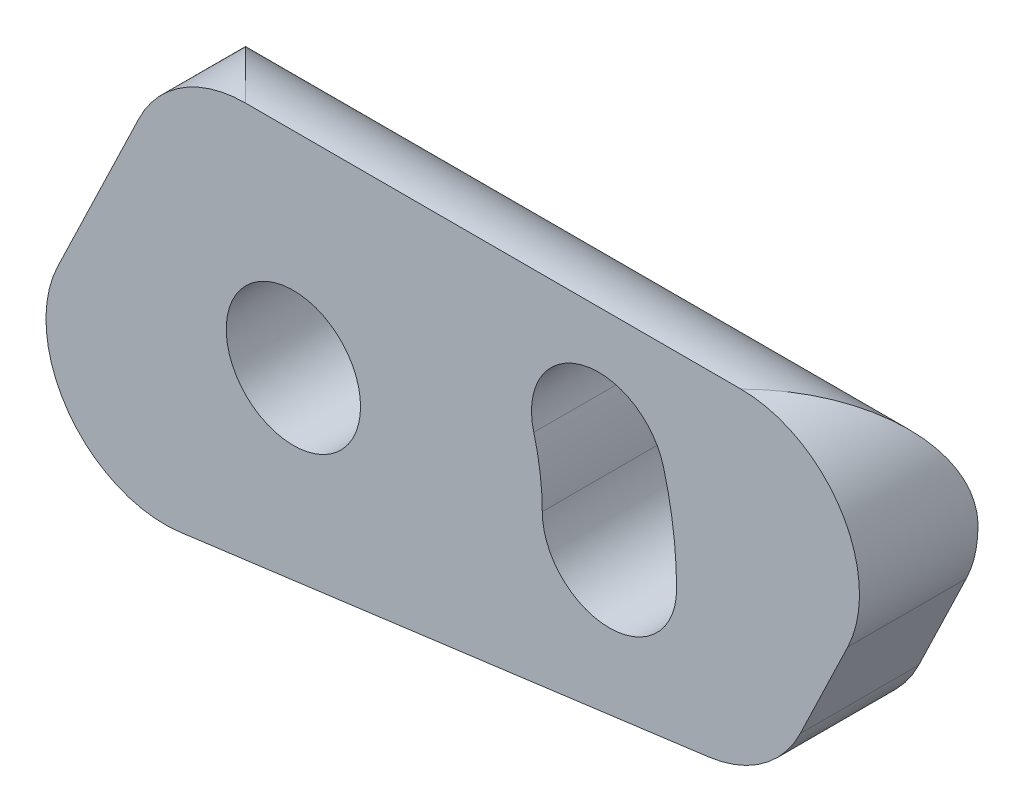
ISO-10303-21;
HEADER;
FILE_DESCRIPTION(('STEP AP214'),'2;1');
FILE_NAME('part.step','',(''),(''),'','','');
FILE_SCHEMA(('AUTOMOTIVE_DESIGN { 1 0 10303 214 1 1 1 1 }'));
ENDSEC;
DATA;
#1=APPLICATION_CONTEXT('core data for automotive mechanical design processes');
#2=APPLICATION_PROTOCOL_DEFINITION('international standard','automotive_design',2000,#1);
#3=PRODUCT_CONTEXT('',#1,'mechanical');
#4=PRODUCT('Part','Part','',(#3));
#5=PRODUCT_RELATED_PRODUCT_CATEGORY('part','',(#4));
#6=PRODUCT_DEFINITION_FORMATION('','',#4);
#7=PRODUCT_DEFINITION_CONTEXT('part definition',#1,'design');
#8=PRODUCT_DEFINITION('design','',#6,#7);
#9=PRODUCT_DEFINITION_SHAPE('','',#8);
#10=(LENGTH_UNIT() NAMED_UNIT(*) SI_UNIT(.MILLI.,.METRE.));
#11=(NAMED_UNIT(*) PLANE_ANGLE_UNIT() SI_UNIT($,.RADIAN.));
#12=(NAMED_UNIT(*) SI_UNIT($,.STERADIAN.) SOLID_ANGLE_UNIT());
#13=UNCERTAINTY_MEASURE_WITH_UNIT(LENGTH_MEASURE(1.E-05),#10,'distance_accuracy_value','');
#14=(GEOMETRIC_REPRESENTATION_CONTEXT(3) GLOBAL_UNCERTAINTY_ASSIGNED_CONTEXT((#13)) GLOBAL_UNIT_ASSIGNED_CONTEXT((#10,
#11,#12)) REPRESENTATION_CONTEXT('',''));
#15=CARTESIAN_POINT('',(0.,0.,0.));
#16=DIRECTION('',(0.,0.,1.));
#17=DIRECTION('',(1.,0.,0.));
#18=AXIS2_PLACEMENT_3D('',#15,#16,#17);
#19=CARTESIAN_POINT('',(8.46798716239551,12.175533228522,3.));
#20=DIRECTION('',(0.,0.,-1.));
#21=DIRECTION('',(-1.,0.,0.));
#22=AXIS2_PLACEMENT_3D('',#19,#20,#21);
#23=CYLINDRICAL_SURFACE('',#22,1.7);
#24=CARTESIAN_POINT('',(8.46798716239551,12.175533228522,0.));
#25=DIRECTION('',(0.,0.,1.));
#26=DIRECTION('',(1.,0.,0.));
#27=AXIS2_PLACEMENT_3D('',#24,#25,#26);
#28=CIRCLE('',#27,1.7);
#29=CARTESIAN_POINT('',(6.76798716239551,12.175533228522,0.));
#30=VERTEX_POINT('',#29);
#31=CARTESIAN_POINT('',(10.1679871623955,12.175533228522,0.));
#32=VERTEX_POINT('',#31);
#33=EDGE_CURVE('E170',#30,#32,#28,.T.);
#34=ORIENTED_EDGE('',*,*,#33,.F.);
#35=DIRECTION('',(0.,0.,1.));
#36=VECTOR('',#35,1.);
#37=CARTESIAN_POINT('',(6.76798716239551,12.175533228522,0.));
#38=LINE('',#37,#36);
#39=CARTESIAN_POINT('',(6.76798716239551,12.175533228522,3.));
#40=VERTEX_POINT('',#39);
#41=EDGE_CURVE('E154',#30,#40,#38,.T.);
#42=ORIENTED_EDGE('',*,*,#41,.T.);
#43=CARTESIAN_POINT('',(8.46798716239551,12.175533228522,3.));
#44=DIRECTION('',(0.,0.,1.));
#45=DIRECTION('',(1.,0.,0.));
#46=AXIS2_PLACEMENT_3D('',#43,#44,#45);
#47=CIRCLE('',#46,1.7);
#48=CARTESIAN_POINT('',(10.1679871623955,12.175533228522,3.));
#49=VERTEX_POINT('',#48);
#50=EDGE_CURVE('E173',#40,#49,#47,.T.);
#51=ORIENTED_EDGE('',*,*,#50,.T.);
#52=DIRECTION('',(0.,0.,1.));
#53=VECTOR('',#52,1.);
#54=CARTESIAN_POINT('',(10.1679871623955,12.175533228522,0.));
#55=LINE('',#54,#53);
#56=EDGE_CURVE('E159',#32,#49,#55,.T.);
#57=ORIENTED_EDGE('',*,*,#56,.F.);
#58=EDGE_LOOP('',(#34,#42,#51,#57));
#59=FACE_BOUND('',#58,.T.);
#60=ADVANCED_FACE('F41',(#59),#23,.F.);
#61=CARTESIAN_POINT('',(0.,0.,3.));
#62=DIRECTION('',(0.,0.,1.));
#63=DIRECTION('',(1.,0.,0.));
#64=AXIS2_PLACEMENT_3D('',#61,#62,#63);
#65=PLANE('',#64);
#66=CARTESIAN_POINT('',(0.467987162395512,12.175533228522,3.));
#67=DIRECTION('',(0.,0.,-1.));
#68=DIRECTION('',(1.,0.,0.));
#69=AXIS2_PLACEMENT_3D('',#66,#67,#68);
#70=CIRCLE('',#69,6.3);
#71=CARTESIAN_POINT('',(6.55331986801665,13.8060932126679,3.));
#72=VERTEX_POINT('',#71);
#73=EDGE_CURVE('E168',#72,#40,#70,.T.);
#74=ORIENTED_EDGE('',*,*,#73,.F.);
#75=CARTESIAN_POINT('',(8.19539377270807,14.2460855893421,3.));
#76=DIRECTION('',(0.,0.,1.));
#77=DIRECTION('',(1.,0.,0.));
#78=AXIS2_PLACEMENT_3D('',#75,#76,#77);
#79=CIRCLE('',#78,1.7);
#80=CARTESIAN_POINT('',(9.83746767739949,14.6860779660164,3.));
#81=VERTEX_POINT('',#80);
#82=EDGE_CURVE('E151',#81,#72,#79,.T.);
#83=ORIENTED_EDGE('',*,*,#82,.F.);
#84=CARTESIAN_POINT('',(0.467987162395512,12.175533228522,3.));
#85=DIRECTION('',(0.,0.,1.));
#86=DIRECTION('',(1.,0.,0.));
#87=AXIS2_PLACEMENT_3D('',#84,#85,#86);
#88=CIRCLE('',#87,9.7);
#89=EDGE_CURVE('E164',#49,#81,#88,.T.);
#90=ORIENTED_EDGE('',*,*,#89,.F.);
#91=ORIENTED_EDGE('',*,*,#50,.F.);
#92=EDGE_LOOP('',(#74,#83,#90,#91));
#93=FACE_BOUND('',#92,.T.);
#94=CARTESIAN_POINT('',(0.467987162395512,12.175533228522,3.));
#95=DIRECTION('',(0.,0.,1.));
#96=DIRECTION('',(1.,0.,0.));
#97=AXIS2_PLACEMENT_3D('',#94,#95,#96);
#98=CIRCLE('',#97,1.7);
#99=CARTESIAN_POINT('',(2.16798716239551,12.175533228522,3.));
#100=VERTEX_POINT('',#99);
#101=EDGE_CURVE('E178',#100,#100,#98,.T.);
#102=ORIENTED_EDGE('',*,*,#101,.F.);
#103=EDGE_LOOP('',(#102));
#104=FACE_BOUND('',#103,.T.);
#105=DIRECTION('',(0.99144486137381,0.130526192220051,0.));
#106=VECTOR('',#105,1.);
#107=CARTESIAN_POINT('',(12.5948746510789,9.1157715839845,3.));
#108=LINE('',#107,#106);
#109=CARTESIAN_POINT('',(-2.4025738043084,7.14132003739454,3.));
#110=VERTEX_POINT('',#109);
#111=CARTESIAN_POINT('',(10.9869377400714,8.9040826736874,3.));
#112=VERTEX_POINT('',#111);
#113=EDGE_CURVE('E187',#110,#112,#108,.T.);
#114=ORIENTED_EDGE('',*,*,#113,.T.);
#115=CARTESIAN_POINT('',(10.5953591634112,11.8784172578088,3.));
#116=DIRECTION('',(0.,0.,1.));
#117=DIRECTION('',(1.,0.,0.));
#118=AXIS2_PLACEMENT_3D('',#115,#116,#117);
#119=CIRCLE('',#118,3.);
#120=CARTESIAN_POINT('',(13.2984007934852,10.5770464628058,3.));
#121=VERTEX_POINT('',#120);
#122=EDGE_CURVE('E227',#112,#121,#119,.T.);
#123=ORIENTED_EDGE('',*,*,#122,.T.);
#124=DIRECTION('',(0.433790265001015,0.901013876691335,0.));
#125=VECTOR('',#124,1.);
#126=CARTESIAN_POINT('',(12.5948746510789,9.1157715839845,3.));
#127=LINE('',#126,#125);
#128=CARTESIAN_POINT('',(14.5006293347944,13.074162433519,3.));
#129=VERTEX_POINT('',#128);
#130=EDGE_CURVE('E191',#121,#129,#127,.T.);
#131=ORIENTED_EDGE('',*,*,#130,.T.);
#132=CARTESIAN_POINT('',(11.7975877047204,14.375533228522,3.));
#133=DIRECTION('',(0.,0.,1.));
#134=DIRECTION('',(1.,0.,0.));
#135=AXIS2_PLACEMENT_3D('',#132,#133,#134);
#136=CIRCLE('',#135,3.);
#137=CARTESIAN_POINT('',(11.7975877047204,17.375533228522,3.));
#138=VERTEX_POINT('',#137);
#139=EDGE_CURVE('E224',#129,#138,#136,.T.);
#140=ORIENTED_EDGE('',*,*,#139,.T.);
#141=DIRECTION('',(-1.,0.,0.));
#142=VECTOR('',#141,1.);
#143=CARTESIAN_POINT('',(16.57151062231,17.375533228522,3.));
#144=LINE('',#143,#142);
#145=CARTESIAN_POINT('',(-0.743247375386318,17.375533228522,3.));
#146=VERTEX_POINT('',#145);
#147=EDGE_CURVE('E194',#138,#146,#144,.T.);
#148=ORIENTED_EDGE('',*,*,#147,.T.);
#149=CARTESIAN_POINT('',(-0.743247375386319,14.375533228522,3.));
#150=DIRECTION('',(0.,0.,1.));
#151=DIRECTION('',(1.,0.,0.));
#152=AXIS2_PLACEMENT_3D('',#149,#150,#151);
#153=CIRCLE('',#152,3.);
#154=CARTESIAN_POINT('',(-3.44628900546033,15.6769040235251,3.));
#155=VERTEX_POINT('',#154);
#156=EDGE_CURVE('E222',#146,#155,#153,.T.);
#157=ORIENTED_EDGE('',*,*,#156,.T.);
#158=DIRECTION('',(-0.433790265001015,-0.901013876691335,0.));
#159=VECTOR('',#158,1.);
#160=CARTESIAN_POINT('',(-7.90444776325461,6.41698458928822,3.));
#161=LINE('',#160,#159);
#162=CARTESIAN_POINT('',(-5.49719401104256,11.417025416519,3.));
#163=VERTEX_POINT('',#162);
#164=EDGE_CURVE('E184',#155,#163,#161,.T.);
#165=ORIENTED_EDGE('',*,*,#164,.T.);
#166=CARTESIAN_POINT('',(-2.79415238096855,10.115654621516,3.));
#167=DIRECTION('',(0.,0.,1.));
#168=DIRECTION('',(1.,0.,0.));
#169=AXIS2_PLACEMENT_3D('',#166,#167,#168);
#170=CIRCLE('',#169,3.);
#171=EDGE_CURVE('E220',#163,#110,#170,.T.);
#172=ORIENTED_EDGE('',*,*,#171,.T.);
#173=EDGE_LOOP('',(#114,#123,#131,#140,#148,#157,#165,#172));
#174=FACE_BOUND('',#173,.T.);
#175=ADVANCED_FACE('F261',(#93,#104,#174),#65,.T.);
#176=CARTESIAN_POINT('',(0.,0.,0.));
#177=DIRECTION('',(0.,0.,1.));
#178=DIRECTION('',(1.,0.,0.));
#179=AXIS2_PLACEMENT_3D('',#176,#177,#178);
#180=PLANE('',#179);
#181=CARTESIAN_POINT('',(0.467987162395512,12.175533228522,0.));
#182=DIRECTION('',(0.,0.,1.));
#183=DIRECTION('',(1.,0.,0.));
#184=AXIS2_PLACEMENT_3D('',#181,#182,#183);
#185=CIRCLE('',#184,1.7);
#186=CARTESIAN_POINT('',(2.16798716239551,12.175533228522,0.));
#187=VERTEX_POINT('',#186);
#188=EDGE_CURVE('E176',#187,#187,#185,.T.);
#189=ORIENTED_EDGE('',*,*,#188,.T.);
#190=EDGE_LOOP('',(#189));
#191=FACE_BOUND('',#190,.T.);
#192=DIRECTION('',(-0.433790265001015,-0.901013876691335,0.));
#193=VECTOR('',#192,1.);
#194=CARTESIAN_POINT('',(-7.90444776325461,6.41698458928822,0.));
#195=LINE('',#194,#193);
#196=CARTESIAN_POINT('',(-4.07282983533297,14.375533228522,0.));
#197=VERTEX_POINT('',#196);
#198=CARTESIAN_POINT('',(-5.49719401104256,11.417025416519,0.));
#199=VERTEX_POINT('',#198);
#200=EDGE_CURVE('E181',#197,#199,#195,.T.);
#201=ORIENTED_EDGE('',*,*,#200,.F.);
#202=DIRECTION('',(-1.,0.,0.));
#203=VECTOR('',#202,1.);
#204=CARTESIAN_POINT('',(0.,14.375533228522,0.));
#205=LINE('',#204,#203);
#206=CARTESIAN_POINT('',(6.50032937608157,14.375533228522,0.));
#207=VERTEX_POINT('',#206);
#208=EDGE_CURVE('E144',#197,#207,#205,.F.);
#209=ORIENTED_EDGE('',*,*,#208,.T.);
#210=CARTESIAN_POINT('',(8.19539377270807,14.2460855893421,0.));
#211=DIRECTION('',(0.,0.,1.));
#212=DIRECTION('',(1.,0.,0.));
#213=AXIS2_PLACEMENT_3D('',#210,#211,#212);
#214=CIRCLE('',#213,1.7);
#215=CARTESIAN_POINT('',(6.55331986801665,13.8060932126679,0.));
#216=VERTEX_POINT('',#215);
#217=EDGE_CURVE('E135',#207,#216,#214,.T.);
#218=ORIENTED_EDGE('',*,*,#217,.T.);
#219=CARTESIAN_POINT('',(0.467987162395512,12.175533228522,0.));
#220=DIRECTION('',(0.,0.,-1.));
#221=DIRECTION('',(1.,0.,0.));
#222=AXIS2_PLACEMENT_3D('',#219,#220,#221);
#223=CIRCLE('',#222,6.3);
#224=EDGE_CURVE('E141',#216,#30,#223,.T.);
#225=ORIENTED_EDGE('',*,*,#224,.T.);
#226=ORIENTED_EDGE('',*,*,#33,.T.);
#227=CARTESIAN_POINT('',(0.467987162395512,12.175533228522,0.));
#228=DIRECTION('',(0.,0.,1.));
#229=DIRECTION('',(1.,0.,0.));
#230=AXIS2_PLACEMENT_3D('',#227,#228,#229);
#231=CIRCLE('',#230,9.7);
#232=CARTESIAN_POINT('',(9.9152089762411,14.375533228522,0.));
#233=VERTEX_POINT('',#232);
#234=EDGE_CURVE('E145',#32,#233,#231,.T.);
#235=ORIENTED_EDGE('',*,*,#234,.T.);
#236=DIRECTION('',(-1.,0.,0.));
#237=VECTOR('',#236,1.);
#238=CARTESIAN_POINT('',(0.,14.375533228522,0.));
#239=LINE('',#238,#237);
#240=CARTESIAN_POINT('',(14.7975877047204,14.375533228522,0.));
#241=VERTEX_POINT('',#240);
#242=EDGE_CURVE('E238',#233,#241,#239,.F.);
#243=ORIENTED_EDGE('',*,*,#242,.T.);
#244=CARTESIAN_POINT('',(11.7975877047204,14.375533228522,0.));
#245=DIRECTION('',(0.,0.,1.));
#246=DIRECTION('',(1.,0.,0.));
#247=AXIS2_PLACEMENT_3D('',#244,#245,#246);
#248=CIRCLE('',#247,3.);
#249=CARTESIAN_POINT('',(14.5006293347944,13.074162433519,0.));
#250=VERTEX_POINT('',#249);
#251=EDGE_CURVE('E211',#241,#250,#248,.F.);
#252=ORIENTED_EDGE('',*,*,#251,.T.);
#253=DIRECTION('',(0.433790265001015,0.901013876691335,0.));
#254=VECTOR('',#253,1.);
#255=CARTESIAN_POINT('',(12.5948746510789,9.1157715839845,0.));
#256=LINE('',#255,#254);
#257=CARTESIAN_POINT('',(13.2984007934852,10.5770464628058,0.));
#258=VERTEX_POINT('',#257);
#259=EDGE_CURVE('E188',#258,#250,#256,.T.);
#260=ORIENTED_EDGE('',*,*,#259,.F.);
#261=CARTESIAN_POINT('',(10.5953591634112,11.8784172578088,0.));
#262=DIRECTION('',(0.,0.,1.));
#263=DIRECTION('',(1.,0.,0.));
#264=AXIS2_PLACEMENT_3D('',#261,#262,#263);
#265=CIRCLE('',#264,3.);
#266=CARTESIAN_POINT('',(10.9869377400714,8.9040826736874,0.));
#267=VERTEX_POINT('',#266);
#268=EDGE_CURVE('E213',#258,#267,#265,.F.);
#269=ORIENTED_EDGE('',*,*,#268,.T.);
#270=DIRECTION('',(0.99144486137381,0.130526192220051,0.));
#271=VECTOR('',#270,1.);
#272=CARTESIAN_POINT('',(12.5948746510789,9.1157715839845,0.));
#273=LINE('',#272,#271);
#274=CARTESIAN_POINT('',(-2.4025738043084,7.14132003739454,0.));
#275=VERTEX_POINT('',#274);
#276=EDGE_CURVE('E199',#275,#267,#273,.T.);
#277=ORIENTED_EDGE('',*,*,#276,.F.);
#278=CARTESIAN_POINT('',(-2.79415238096855,10.115654621516,0.));
#279=DIRECTION('',(0.,0.,1.));
#280=DIRECTION('',(1.,0.,0.));
#281=AXIS2_PLACEMENT_3D('',#278,#279,#280);
#282=CIRCLE('',#281,3.);
#283=EDGE_CURVE('E208',#275,#199,#282,.F.);
#284=ORIENTED_EDGE('',*,*,#283,.T.);
#285=EDGE_LOOP('',(#201,#209,#218,#225,#226,#235,#243,#252,#260,#269,#277,#284));
#286=FACE_BOUND('',#285,.T.);
#287=ADVANCED_FACE('F138',(#191,#286),#180,.F.);
#288=CARTESIAN_POINT('',(-7.90444776325461,6.41698458928822,3.));
#289=DIRECTION('',(0.901013876691335,-0.433790265001015,0.));
#290=DIRECTION('',(0.433790265001015,0.901013876691335,0.));
#291=AXIS2_PLACEMENT_3D('',#288,#289,#290);
#292=PLANE('',#291);
#293=DIRECTION('',(0.,0.,-1.));
#294=VECTOR('',#293,1.);
#295=CARTESIAN_POINT('',(-3.44628900546033,15.6769040235251,3.));
#296=LINE('',#295,#294);
#297=CARTESIAN_POINT('',(-3.44628900546033,15.6769040235251,0.296958369925994));
#298=VERTEX_POINT('',#297);
#299=EDGE_CURVE('E231',#155,#298,#296,.T.);
#300=ORIENTED_EDGE('',*,*,#299,.T.);
#301=CARTESIAN_POINT('',(-4.07282983533297,14.375533228522,3.));
#302=DIRECTION('',(0.901013876691335,-0.433790265001015,0.));
#303=DIRECTION('',(-0.433790265001015,-0.901013876691335,0.));
#304=AXIS2_PLACEMENT_3D('',#301,#302,#303);
#305=ELLIPSE('',#304,3.32958245994665,3.);
#306=EDGE_CURVE('E236',#298,#197,#305,.F.);
#307=ORIENTED_EDGE('',*,*,#306,.T.);
#308=ORIENTED_EDGE('',*,*,#200,.T.);
#309=DIRECTION('',(0.,0.,-1.));
#310=VECTOR('',#309,1.);
#311=CARTESIAN_POINT('',(-5.49719401104256,11.417025416519,3.));
#312=LINE('',#311,#310);
#313=EDGE_CURVE('E229',#199,#163,#312,.F.);
#314=ORIENTED_EDGE('',*,*,#313,.T.);
#315=ORIENTED_EDGE('',*,*,#164,.F.);
#316=EDGE_LOOP('',(#300,#307,#308,#314,#315));
#317=FACE_BOUND('',#316,.T.);
#318=ADVANCED_FACE('F273',(#317),#292,.F.);
#319=CARTESIAN_POINT('',(12.5948746510789,9.1157715839845,3.));
#320=DIRECTION('',(-0.130526192220051,0.99144486137381,0.));
#321=DIRECTION('',(-0.99144486137381,-0.130526192220051,0.));
#322=AXIS2_PLACEMENT_3D('',#319,#320,#321);
#323=PLANE('',#322);
#324=ORIENTED_EDGE('',*,*,#276,.T.);
#325=DIRECTION('',(0.,0.,-1.));
#326=VECTOR('',#325,1.);
#327=CARTESIAN_POINT('',(10.9869377400714,8.9040826736874,3.));
#328=LINE('',#327,#326);
#329=EDGE_CURVE('E218',#267,#112,#328,.F.);
#330=ORIENTED_EDGE('',*,*,#329,.T.);
#331=ORIENTED_EDGE('',*,*,#113,.F.);
#332=DIRECTION('',(0.,0.,-1.));
#333=VECTOR('',#332,1.);
#334=CARTESIAN_POINT('',(-2.4025738043084,7.14132003739454,3.));
#335=LINE('',#334,#333);
#336=EDGE_CURVE('E215',#110,#275,#335,.T.);
#337=ORIENTED_EDGE('',*,*,#336,.T.);
#338=EDGE_LOOP('',(#324,#330,#331,#337));
#339=FACE_BOUND('',#338,.T.);
#340=ADVANCED_FACE('F277',(#339),#323,.F.);
#341=CARTESIAN_POINT('',(12.5948746510789,9.1157715839845,3.));
#342=DIRECTION('',(-0.901013876691335,0.433790265001015,0.));
#343=DIRECTION('',(-0.433790265001015,-0.901013876691335,0.));
#344=AXIS2_PLACEMENT_3D('',#341,#342,#343);
#345=PLANE('',#344);
#346=ORIENTED_EDGE('',*,*,#130,.F.);
#347=DIRECTION('',(0.,0.,-1.));
#348=VECTOR('',#347,1.);
#349=CARTESIAN_POINT('',(13.2984007934852,10.5770464628058,3.));
#350=LINE('',#349,#348);
#351=EDGE_CURVE('E205',#121,#258,#350,.T.);
#352=ORIENTED_EDGE('',*,*,#351,.T.);
#353=ORIENTED_EDGE('',*,*,#259,.T.);
#354=DIRECTION('',(0.,0.,-1.));
#355=VECTOR('',#354,1.);
#356=CARTESIAN_POINT('',(14.5006293347944,13.074162433519,3.));
#357=LINE('',#356,#355);
#358=EDGE_CURVE('E197',#250,#129,#357,.F.);
#359=ORIENTED_EDGE('',*,*,#358,.T.);
#360=EDGE_LOOP('',(#346,#352,#353,#359));
#361=FACE_BOUND('',#360,.T.);
#362=ADVANCED_FACE('F266',(#361),#345,.F.);
#363=CARTESIAN_POINT('',(0.467987162395512,12.175533228522,3.));
#364=DIRECTION('',(0.,0.,-1.));
#365=DIRECTION('',(-1.,0.,0.));
#366=AXIS2_PLACEMENT_3D('',#363,#364,#365);
#367=CYLINDRICAL_SURFACE('',#366,1.7);
#368=ORIENTED_EDGE('',*,*,#101,.T.);
#369=EDGE_LOOP('',(#368));
#370=FACE_BOUND('',#369,.T.);
#371=ORIENTED_EDGE('',*,*,#188,.F.);
#372=EDGE_LOOP('',(#371));
#373=FACE_BOUND('',#372,.T.);
#374=ADVANCED_FACE('F263',(#370,#373),#367,.F.);
#375=CARTESIAN_POINT('',(0.467987162395512,12.175533228522,0.));
#376=DIRECTION('',(0.,0.,1.));
#377=DIRECTION('',(1.,0.,0.));
#378=AXIS2_PLACEMENT_3D('',#375,#376,#377);
#379=CYLINDRICAL_SURFACE('',#378,6.3);
#380=ORIENTED_EDGE('',*,*,#73,.T.);
#381=ORIENTED_EDGE('',*,*,#41,.F.);
#382=ORIENTED_EDGE('',*,*,#224,.F.);
#383=DIRECTION('',(0.,0.,1.));
#384=VECTOR('',#383,1.);
#385=CARTESIAN_POINT('',(6.55331986801665,13.8060932126679,0.));
#386=LINE('',#385,#384);
#387=EDGE_CURVE('E148',#216,#72,#386,.T.);
#388=ORIENTED_EDGE('',*,*,#387,.T.);
#389=EDGE_LOOP('',(#380,#381,#382,#388));
#390=FACE_BOUND('',#389,.T.);
#391=ADVANCED_FACE('F157',(#390),#379,.T.);
#392=CARTESIAN_POINT('',(8.19539377270807,14.2460855893421,0.));
#393=DIRECTION('',(0.,0.,1.));
#394=DIRECTION('',(1.,0.,0.));
#395=AXIS2_PLACEMENT_3D('',#392,#393,#394);
#396=CYLINDRICAL_SURFACE('',#395,1.7);
#397=ORIENTED_EDGE('',*,*,#217,.F.);
#398=CARTESIAN_POINT('',(6.50032937608157,14.375533228522,0.));
#399=CARTESIAN_POINT('',(6.50371525829877,14.4199709038334,-8.46266808411723E-06));
#400=CARTESIAN_POINT('',(6.50886307410484,14.4642666540885,0.000987109372657286));
#401=CARTESIAN_POINT('',(6.5225942291974,14.5522139107679,0.00488615134587774));
#402=CARTESIAN_POINT('',(6.53117571881598,14.595865750951,0.00778859461531525));
#403=CARTESIAN_POINT('',(6.55163625835488,14.6819883662764,0.0153815783493758));
#404=CARTESIAN_POINT('',(6.56349789287961,14.7244641103427,0.0200627228786175));
#405=CARTESIAN_POINT('',(6.5904025970355,14.8081695570537,0.0310590050104794));
#406=CARTESIAN_POINT('',(6.60544597905272,14.8493991368945,0.0373743030689781));
#407=CARTESIAN_POINT('',(6.65507485215863,14.9706692961421,0.0584842882618556));
#408=CARTESIAN_POINT('',(6.69421483394794,15.0485227187544,0.0754650082177046));
#409=CARTESIAN_POINT('',(6.78333813836786,15.1966642564134,0.113545063897774));
#410=CARTESIAN_POINT('',(6.83333512929694,15.2669426665724,0.134649587848461));
#411=CARTESIAN_POINT('',(6.94697250091315,15.4036301643796,0.180676224665285));
#412=CARTESIAN_POINT('',(7.01134592459536,15.4693744048313,0.2057649581385));
#413=CARTESIAN_POINT('',(7.14986925088648,15.5897028999486,0.255906238038633));
#414=CARTESIAN_POINT('',(7.22402609958,15.6442791546158,0.280958745849049));
#415=CARTESIAN_POINT('',(7.38693095861916,15.7448305867284,0.330094685274596));
#416=CARTESIAN_POINT('',(7.47636309692839,15.7898183693597,0.353954527542413));
#417=CARTESIAN_POINT('',(7.6630848644035,15.8637052603192,0.394784451941297));
#418=CARTESIAN_POINT('',(7.76036406950816,15.8926253227506,0.41176349953676));
#419=CARTESIAN_POINT('',(7.95077542333132,15.9309363841609,0.434618765774243));
#420=CARTESIAN_POINT('',(8.04349381256517,15.941849709158,0.441356126063941));
#421=CARTESIAN_POINT('',(8.22964270898798,15.9482853088897,0.445303619392157));
#422=CARTESIAN_POINT('',(8.32307273486938,15.9438171990592,0.442519704496461));
#423=CARTESIAN_POINT('',(8.49642574016269,15.9212339296713,0.428824760114349));
#424=CARTESIAN_POINT('',(8.57665339462429,15.9047707857087,0.418899214897571));
#425=CARTESIAN_POINT('',(8.73308540084457,15.8608585952704,0.393383524437453));
#426=CARTESIAN_POINT('',(8.80928841502023,15.8334059221263,0.377791509351959));
#427=CARTESIAN_POINT('',(8.96117397562298,15.7662604851871,0.341537750136999));
#428=CARTESIAN_POINT('',(9.03648357704446,15.7258740751208,0.320607443196925));
#429=CARTESIAN_POINT('',(9.17982557589054,15.6346539283948,0.276549744944615));
#430=CARTESIAN_POINT('',(9.24785131126884,15.5838107496971,0.253420378191576));
#431=CARTESIAN_POINT('',(9.38443383443326,15.4648864023662,0.203930334486317));
#432=CARTESIAN_POINT('',(9.45176680339063,15.3953943641539,0.177564492735257));
#433=CARTESIAN_POINT('',(9.57403606882213,15.2454262240089,0.127803879752394));
#434=CARTESIAN_POINT('',(9.62899037619173,15.1649663576314,0.104404813845683));
#435=CARTESIAN_POINT('',(9.71141154759693,15.0185121492215,0.0690353929094367));
#436=CARTESIAN_POINT('',(9.74226988085291,14.9547433653638,0.0556977467157358));
#437=CARTESIAN_POINT('',(9.79602940069052,14.8231843809553,0.0328256132832918));
#438=CARTESIAN_POINT('',(9.81891826185588,14.7553881394993,0.023297013694328));
#439=CARTESIAN_POINT('',(9.83746767739949,14.6860779660164,0.0161162948240533));
#440=B_SPLINE_CURVE_WITH_KNOTS('',3,(#398,#399,#400,#401,#402,#403,#404,#405,#406,#407,#408,
#409,#410,#411,#412,#413,#414,#415,#416,#417,#418,#419,#420,#421,#422,#423,#424,#425,#426,#427,
#428,#429,#430,#431,#432,#433,#434,#435,#436,#437,#438,#439),.UNSPECIFIED.,.F.,.F.,(4,2,2,2,2,2,
2,2,2,2,2,2,2,2,2,2,2,2,2,2,4),(0.,0.133641774660227,0.267211655239287,0.400085551179054,
0.532972498825942,0.798038260234109,1.06343967780895,1.34836286896121,1.63348945102274,
1.94059641261132,2.24730192663485,2.52642615024662,2.8053759159247,3.05179969946304,
3.29830487275386,3.56123373024967,3.82440105247696,4.12390885386718,4.42297801671124,
4.63862297336156,4.85459997575603),.UNSPECIFIED.);
#441=CARTESIAN_POINT('',(9.83746767739949,14.6860779660164,0.0161162948240532));
#442=VERTEX_POINT('',#441);
#443=EDGE_CURVE('E57',#207,#442,#440,.T.);
#444=ORIENTED_EDGE('',*,*,#443,.T.);
#445=DIRECTION('',(0.,0.,1.));
#446=VECTOR('',#445,1.);
#447=CARTESIAN_POINT('',(9.83746767739949,14.6860779660164,0.));
#448=LINE('',#447,#446);
#449=EDGE_CURVE('E155',#442,#81,#448,.T.);
#450=ORIENTED_EDGE('',*,*,#449,.T.);
#451=ORIENTED_EDGE('',*,*,#82,.T.);
#452=ORIENTED_EDGE('',*,*,#387,.F.);
#453=EDGE_LOOP('',(#397,#444,#450,#451,#452));
#454=FACE_BOUND('',#453,.T.);
#455=ADVANCED_FACE('F149',(#454),#396,.F.);
#456=CARTESIAN_POINT('',(0.467987162395512,12.175533228522,0.));
#457=DIRECTION('',(0.,0.,1.));
#458=DIRECTION('',(1.,0.,0.));
#459=AXIS2_PLACEMENT_3D('',#456,#457,#458);
#460=CYLINDRICAL_SURFACE('',#459,9.7);
#461=ORIENTED_EDGE('',*,*,#449,.F.);
#462=CARTESIAN_POINT('',(9.83746767739949,14.6860779660164,0.0161162948240532));
#463=CARTESIAN_POINT('',(9.85124600300083,14.6346648992915,0.0107566565540372));
#464=CARTESIAN_POINT('',(9.86461360737169,14.5830796378043,0.00673381285035748));
#465=CARTESIAN_POINT('',(9.89052737365222,14.4795647253061,0.00136171457572494));
#466=CARTESIAN_POINT('',(9.90307353556189,14.4276350742952,1.24600047183219E-05));
#467=CARTESIAN_POINT('',(9.91520897624111,14.375533228522,0.));
#468=B_SPLINE_CURVE_WITH_KNOTS('',3,(#462,#463,#464,#465,#466,#467),.UNSPECIFIED.,.F.,.F.,(4,2,
4),(0.,0.160322293793135,0.320644587583047),.UNSPECIFIED.);
#469=EDGE_CURVE('E50',#442,#233,#468,.T.);
#470=ORIENTED_EDGE('',*,*,#469,.T.);
#471=ORIENTED_EDGE('',*,*,#234,.F.);
#472=ORIENTED_EDGE('',*,*,#56,.T.);
#473=ORIENTED_EDGE('',*,*,#89,.T.);
#474=EDGE_LOOP('',(#461,#470,#471,#472,#473));
#475=FACE_BOUND('',#474,.T.);
#476=ADVANCED_FACE('F254',(#475),#460,.F.);
#477=CARTESIAN_POINT('',(10.5953591634112,11.8784172578088,3.));
#478=DIRECTION('',(0.,0.,-1.));
#479=DIRECTION('',(-1.,0.,0.));
#480=AXIS2_PLACEMENT_3D('',#477,#478,#479);
#481=CYLINDRICAL_SURFACE('',#480,3.);
#482=ORIENTED_EDGE('',*,*,#122,.F.);
#483=ORIENTED_EDGE('',*,*,#329,.F.);
#484=ORIENTED_EDGE('',*,*,#268,.F.);
#485=ORIENTED_EDGE('',*,*,#351,.F.);
#486=EDGE_LOOP('',(#482,#483,#484,#485));
#487=FACE_BOUND('',#486,.T.);
#488=ADVANCED_FACE('F258',(#487),#481,.T.);
#489=CARTESIAN_POINT('',(11.7975877047204,14.375533228522,3.));
#490=DIRECTION('',(0.,0.,-1.));
#491=DIRECTION('',(-1.,0.,0.));
#492=AXIS2_PLACEMENT_3D('',#489,#490,#491);
#493=CYLINDRICAL_SURFACE('',#492,3.);
#494=ORIENTED_EDGE('',*,*,#251,.F.);
#495=CARTESIAN_POINT('',(11.7975877047204,14.375533228522,3.));
#496=DIRECTION('',(-0.707106781186548,0.,-0.707106781186547));
#497=DIRECTION('',(0.707106781186548,0.,-0.707106781186547));
#498=AXIS2_PLACEMENT_3D('',#495,#496,#497);
#499=ELLIPSE('',#498,4.24264068711928,3.);
#500=EDGE_CURVE('E11',#241,#138,#499,.F.);
#501=ORIENTED_EDGE('',*,*,#500,.T.);
#502=ORIENTED_EDGE('',*,*,#139,.F.);
#503=ORIENTED_EDGE('',*,*,#358,.F.);
#504=EDGE_LOOP('',(#494,#501,#502,#503));
#505=FACE_BOUND('',#504,.T.);
#506=ADVANCED_FACE('F287',(#505),#493,.T.);
#507=CARTESIAN_POINT('',(-0.743247375386319,14.375533228522,3.));
#508=DIRECTION('',(0.,0.,-1.));
#509=DIRECTION('',(-1.,0.,0.));
#510=AXIS2_PLACEMENT_3D('',#507,#508,#509);
#511=CYLINDRICAL_SURFACE('',#510,3.);
#512=ORIENTED_EDGE('',*,*,#156,.F.);
#513=CARTESIAN_POINT('',(-0.743247375386319,14.375533228522,3.));
#514=DIRECTION('',(0.707106781186547,0.,-0.707106781186547));
#515=DIRECTION('',(-0.707106781186547,0.,-0.707106781186547));
#516=AXIS2_PLACEMENT_3D('',#513,#514,#515);
#517=ELLIPSE('',#516,4.24264068711928,3.);
#518=EDGE_CURVE('E234',#146,#298,#517,.F.);
#519=ORIENTED_EDGE('',*,*,#518,.T.);
#520=ORIENTED_EDGE('',*,*,#299,.F.);
#521=EDGE_LOOP('',(#512,#519,#520));
#522=FACE_BOUND('',#521,.T.);
#523=ADVANCED_FACE('F291',(#522),#511,.T.);
#524=CARTESIAN_POINT('',(-2.79415238096855,10.115654621516,3.));
#525=DIRECTION('',(0.,0.,-1.));
#526=DIRECTION('',(-1.,0.,0.));
#527=AXIS2_PLACEMENT_3D('',#524,#525,#526);
#528=CYLINDRICAL_SURFACE('',#527,3.);
#529=ORIENTED_EDGE('',*,*,#171,.F.);
#530=ORIENTED_EDGE('',*,*,#313,.F.);
#531=ORIENTED_EDGE('',*,*,#283,.F.);
#532=ORIENTED_EDGE('',*,*,#336,.F.);
#533=EDGE_LOOP('',(#529,#530,#531,#532));
#534=FACE_BOUND('',#533,.T.);
#535=ADVANCED_FACE('F294',(#534),#528,.T.);
#536=CARTESIAN_POINT('',(16.57151062231,14.375533228522,3.));
#537=DIRECTION('',(-1.,0.,0.));
#538=DIRECTION('',(0.,0.,1.));
#539=AXIS2_PLACEMENT_3D('',#536,#537,#538);
#540=CYLINDRICAL_SURFACE('',#539,3.);
#541=ORIENTED_EDGE('',*,*,#443,.F.);
#542=ORIENTED_EDGE('',*,*,#208,.F.);
#543=ORIENTED_EDGE('',*,*,#306,.F.);
#544=ORIENTED_EDGE('',*,*,#518,.F.);
#545=ORIENTED_EDGE('',*,*,#147,.F.);
#546=ORIENTED_EDGE('',*,*,#500,.F.);
#547=ORIENTED_EDGE('',*,*,#242,.F.);
#548=ORIENTED_EDGE('',*,*,#469,.F.);
#549=EDGE_LOOP('',(#541,#542,#543,#544,#545,#546,#547,#548));
#550=FACE_BOUND('',#549,.T.);
#551=ADVANCED_FACE('F43',(#550),#540,.T.);
#552=CLOSED_SHELL('',(#60,#175,#287,#318,#340,#362,#374,#391,#455,#476,#488,#506,#523,#535,#551));
#553=MANIFOLD_SOLID_BREP('B2',#552);
#554=ADVANCED_BREP_SHAPE_REPRESENTATION('',(#18,#553),#14);
#555=SHAPE_DEFINITION_REPRESENTATION(#9,#554);
ENDSEC;
END-ISO-10303-21;
